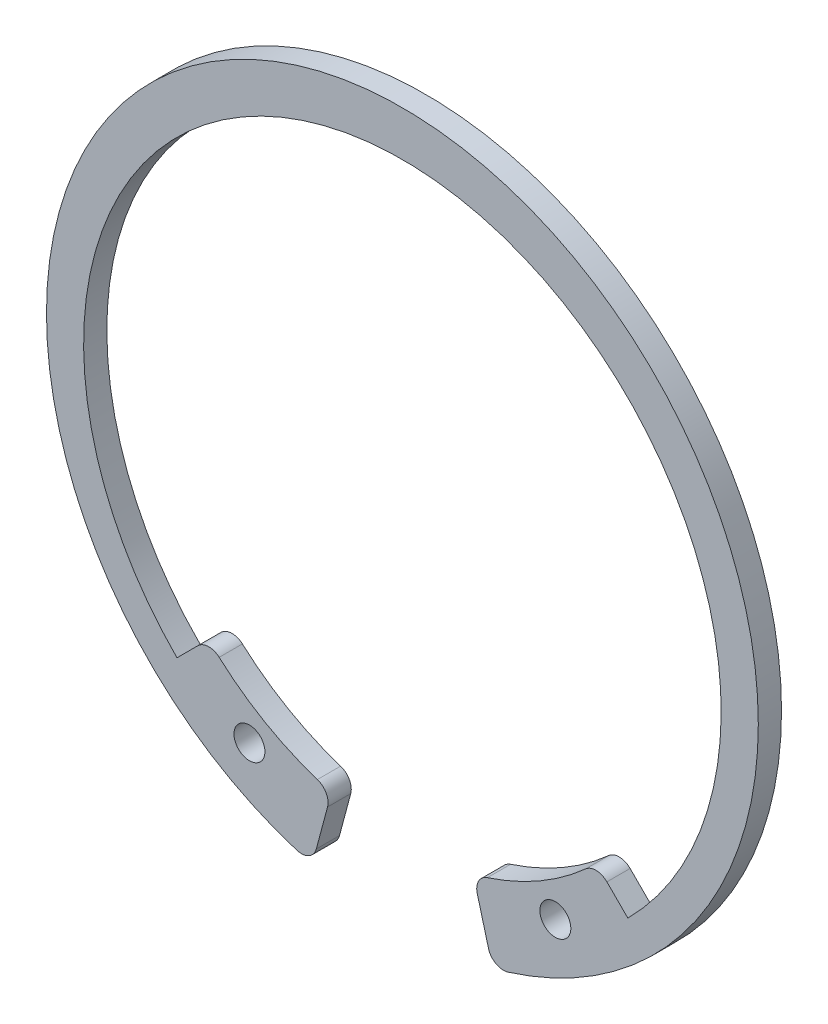
ISO-10303-21;
HEADER;
FILE_DESCRIPTION(('STEP AP214'),'2;1');
FILE_NAME('part.step','',(''),(''),'','','');
FILE_SCHEMA(('AUTOMOTIVE_DESIGN { 1 0 10303 214 1 1 1 1 }'));
ENDSEC;
DATA;
#1=APPLICATION_CONTEXT('core data for automotive mechanical design processes');
#2=APPLICATION_PROTOCOL_DEFINITION('international standard','automotive_design',2000,#1);
#3=PRODUCT_CONTEXT('',#1,'mechanical');
#4=PRODUCT('Part','Part','',(#3));
#5=PRODUCT_RELATED_PRODUCT_CATEGORY('part','',(#4));
#6=PRODUCT_DEFINITION_FORMATION('','',#4);
#7=PRODUCT_DEFINITION_CONTEXT('part definition',#1,'design');
#8=PRODUCT_DEFINITION('design','',#6,#7);
#9=PRODUCT_DEFINITION_SHAPE('','',#8);
#10=(LENGTH_UNIT() NAMED_UNIT(*) SI_UNIT(.MILLI.,.METRE.));
#11=(NAMED_UNIT(*) PLANE_ANGLE_UNIT() SI_UNIT($,.RADIAN.));
#12=(NAMED_UNIT(*) SI_UNIT($,.STERADIAN.) SOLID_ANGLE_UNIT());
#13=UNCERTAINTY_MEASURE_WITH_UNIT(LENGTH_MEASURE(1.E-05),#10,'distance_accuracy_value','');
#14=(GEOMETRIC_REPRESENTATION_CONTEXT(3) GLOBAL_UNCERTAINTY_ASSIGNED_CONTEXT((#13)) GLOBAL_UNIT_ASSIGNED_CONTEXT((#10,
#11,#12)) REPRESENTATION_CONTEXT('',''));
#15=CARTESIAN_POINT('',(0.,0.,0.));
#16=DIRECTION('',(0.,0.,1.));
#17=DIRECTION('',(1.,0.,0.));
#18=AXIS2_PLACEMENT_3D('',#15,#16,#17);
#19=CARTESIAN_POINT('',(12.5086763782379,-13.9228899406109,1.5));
#20=DIRECTION('',(0.,0.,-1.));
#21=DIRECTION('',(-1.,0.,0.));
#22=AXIS2_PLACEMENT_3D('',#19,#20,#21);
#23=PLANE('',#22);
#24=CARTESIAN_POINT('',(-9.88366766904407,-16.9882778844434,1.5));
#25=DIRECTION('',(0.,0.,1.));
#26=DIRECTION('',(1.,0.,0.));
#27=AXIS2_PLACEMENT_3D('',#24,#25,#26);
#28=CIRCLE('',#27,1.);
#29=CARTESIAN_POINT('',(-8.88366766904407,-16.9882778844434,1.5));
#30=VERTEX_POINT('',#29);
#31=EDGE_CURVE('E151',#30,#30,#28,.T.);
#32=ORIENTED_EDGE('',*,*,#31,.F.);
#33=EDGE_LOOP('',(#32));
#34=FACE_BOUND('',#33,.T.);
#35=CARTESIAN_POINT('',(12.5086763782379,-13.9228899406109,1.5));
#36=DIRECTION('',(0.,0.,1.));
#37=DIRECTION('',(-1.,0.,0.));
#38=AXIS2_PLACEMENT_3D('',#35,#36,#37);
#39=CIRCLE('',#38,1.00000000000001);
#40=CARTESIAN_POINT('',(13.2157831594244,-13.2157831594244,1.5));
#41=VERTEX_POINT('',#40);
#42=CARTESIAN_POINT('',(11.8403590783014,-13.1790136158057,1.5));
#43=VERTEX_POINT('',#42);
#44=EDGE_CURVE('E181',#41,#43,#39,.T.);
#45=ORIENTED_EDGE('',*,*,#44,.T.);
#46=CARTESIAN_POINT('',(0.,0.,1.5));
#47=DIRECTION('',(0.,0.,-1.));
#48=DIRECTION('',(1.,0.,0.));
#49=AXIS2_PLACEMENT_3D('',#46,#47,#48);
#50=CIRCLE('',#49,17.7166730225713);
#51=CARTESIAN_POINT('',(5.49318104895808,-16.8435585596416,1.5));
#52=VERTEX_POINT('',#51);
#53=EDGE_CURVE('E146',#43,#52,#50,.T.);
#54=ORIENTED_EDGE('',*,*,#53,.T.);
#55=CARTESIAN_POINT('',(5.80323819354499,-17.7942764815778,1.5));
#56=DIRECTION('',(0.,0.,1.));
#57=DIRECTION('',(-1.,0.,0.));
#58=AXIS2_PLACEMENT_3D('',#55,#56,#57);
#59=CIRCLE('',#58,1.);
#60=CARTESIAN_POINT('',(4.83731236725591,-18.0530955266803,1.5));
#61=VERTEX_POINT('',#60);
#62=EDGE_CURVE('E184',#52,#61,#59,.T.);
#63=ORIENTED_EDGE('',*,*,#62,.T.);
#64=DIRECTION('',(0.258819045102523,-0.965925826289069,0.));
#65=VECTOR('',#64,1.);
#66=CARTESIAN_POINT('',(5.5645589240346,-20.7672166262078,1.5));
#67=LINE('',#66,#65);
#68=CARTESIAN_POINT('',(5.5645589240346,-20.7672166262078,1.5));
#69=VERTEX_POINT('',#68);
#70=EDGE_CURVE('E186',#61,#69,#67,.T.);
#71=ORIENTED_EDGE('',*,*,#70,.T.);
#72=CARTESIAN_POINT('',(6.53048475032366,-20.5083975811053,1.5));
#73=DIRECTION('',(0.,0.,1.));
#74=DIRECTION('',(-1.,0.,0.));
#75=AXIS2_PLACEMENT_3D('',#72,#73,#74);
#76=CIRCLE('',#75,1.);
#77=CARTESIAN_POINT('',(6.82732496624746,-21.4633247438828,1.5));
#78=VERTEX_POINT('',#77);
#79=EDGE_CURVE('E188',#69,#78,#76,.T.);
#80=ORIENTED_EDGE('',*,*,#79,.T.);
#81=CARTESIAN_POINT('',(0.,0.500000000000001,1.5));
#82=DIRECTION('',(0.,0.,1.));
#83=DIRECTION('',(1.,0.,0.));
#84=AXIS2_PLACEMENT_3D('',#81,#82,#83);
#85=CIRCLE('',#84,23.);
#86=CARTESIAN_POINT('',(-6.82732496624744,-21.4633247438828,1.5));
#87=VERTEX_POINT('',#86);
#88=EDGE_CURVE('E190',#78,#87,#85,.T.);
#89=ORIENTED_EDGE('',*,*,#88,.T.);
#90=CARTESIAN_POINT('',(-6.53048475032365,-20.5083975811053,1.5));
#91=DIRECTION('',(0.,0.,1.));
#92=DIRECTION('',(1.,0.,0.));
#93=AXIS2_PLACEMENT_3D('',#90,#91,#92);
#94=CIRCLE('',#93,1.);
#95=CARTESIAN_POINT('',(-5.56455892403457,-20.7672166262078,1.5));
#96=VERTEX_POINT('',#95);
#97=EDGE_CURVE('E192',#87,#96,#94,.T.);
#98=ORIENTED_EDGE('',*,*,#97,.T.);
#99=DIRECTION('',(0.258819045102521,0.965925826289068,0.));
#100=VECTOR('',#99,1.);
#101=CARTESIAN_POINT('',(-5.56455892403457,-20.7672166262078,1.5));
#102=LINE('',#101,#100);
#103=CARTESIAN_POINT('',(-4.83731236725589,-18.0530955266803,1.5));
#104=VERTEX_POINT('',#103);
#105=EDGE_CURVE('E194',#96,#104,#102,.T.);
#106=ORIENTED_EDGE('',*,*,#105,.T.);
#107=CARTESIAN_POINT('',(-5.80323819354496,-17.7942764815777,1.5));
#108=DIRECTION('',(0.,0.,1.));
#109=DIRECTION('',(1.,0.,0.));
#110=AXIS2_PLACEMENT_3D('',#107,#108,#109);
#111=CIRCLE('',#110,1.);
#112=CARTESIAN_POINT('',(-5.49318104895807,-16.8435585596416,1.5));
#113=VERTEX_POINT('',#112);
#114=EDGE_CURVE('E196',#104,#113,#111,.T.);
#115=ORIENTED_EDGE('',*,*,#114,.T.);
#116=CARTESIAN_POINT('',(0.,0.,1.5));
#117=DIRECTION('',(0.,0.,-1.));
#118=DIRECTION('',(1.,0.,0.));
#119=AXIS2_PLACEMENT_3D('',#116,#117,#118);
#120=CIRCLE('',#119,17.7166730225713);
#121=CARTESIAN_POINT('',(-11.8403590783014,-13.1790136158057,1.5));
#122=VERTEX_POINT('',#121);
#123=EDGE_CURVE('E198',#113,#122,#120,.T.);
#124=ORIENTED_EDGE('',*,*,#123,.T.);
#125=CARTESIAN_POINT('',(-12.5086763782379,-13.9228899406109,1.5));
#126=DIRECTION('',(0.,0.,1.));
#127=DIRECTION('',(-1.,0.,0.));
#128=AXIS2_PLACEMENT_3D('',#125,#126,#127);
#129=CIRCLE('',#128,1.);
#130=CARTESIAN_POINT('',(-13.2157831594244,-13.2157831594243,1.5));
#131=VERTEX_POINT('',#130);
#132=EDGE_CURVE('E200',#122,#131,#129,.T.);
#133=ORIENTED_EDGE('',*,*,#132,.T.);
#134=DIRECTION('',(-0.707106781186549,-0.707106781186546,0.));
#135=VECTOR('',#134,1.);
#136=CARTESIAN_POINT('',(-13.2157831594244,-13.2157831594243,1.5));
#137=LINE('',#136,#135);
#138=CARTESIAN_POINT('',(-14.5663996924429,-14.5663996924429,1.5));
#139=VERTEX_POINT('',#138);
#140=EDGE_CURVE('E202',#131,#139,#137,.T.);
#141=ORIENTED_EDGE('',*,*,#140,.T.);
#142=CARTESIAN_POINT('',(0.,0.,1.5));
#143=DIRECTION('',(0.,0.,-1.));
#144=DIRECTION('',(1.,0.,0.));
#145=AXIS2_PLACEMENT_3D('',#142,#143,#144);
#146=CIRCLE('',#145,20.6);
#147=CARTESIAN_POINT('',(14.5663996924429,-14.5663996924429,1.5));
#148=VERTEX_POINT('',#147);
#149=EDGE_CURVE('E51',#139,#148,#146,.T.);
#150=ORIENTED_EDGE('',*,*,#149,.T.);
#151=DIRECTION('',(-0.70710678118655,0.707106781186547,0.));
#152=VECTOR('',#151,1.);
#153=CARTESIAN_POINT('',(13.2157831594244,-13.2157831594244,1.5));
#154=LINE('',#153,#152);
#155=EDGE_CURVE('E46',#148,#41,#154,.T.);
#156=ORIENTED_EDGE('',*,*,#155,.T.);
#157=EDGE_LOOP('',(#45,#54,#63,#71,#80,#89,#98,#106,#115,#124,#133,#141,#150,#156));
#158=FACE_BOUND('',#157,.T.);
#159=CARTESIAN_POINT('',(9.88366766904409,-16.9882778844435,1.5));
#160=DIRECTION('',(0.,0.,1.));
#161=DIRECTION('',(-1.,0.,0.));
#162=AXIS2_PLACEMENT_3D('',#159,#160,#161);
#163=CIRCLE('',#162,1.);
#164=CARTESIAN_POINT('',(8.88366766904408,-16.9882778844435,1.5));
#165=VERTEX_POINT('',#164);
#166=EDGE_CURVE('E321',#165,#165,#163,.T.);
#167=ORIENTED_EDGE('',*,*,#166,.F.);
#168=EDGE_LOOP('',(#167));
#169=FACE_BOUND('',#168,.T.);
#170=ADVANCED_FACE('F31',(#34,#158,#169),#23,.F.);
#171=CARTESIAN_POINT('',(12.5086763782379,-13.9228899406109,0.));
#172=DIRECTION('',(0.,0.,-1.));
#173=DIRECTION('',(-1.,0.,0.));
#174=AXIS2_PLACEMENT_3D('',#171,#172,#173);
#175=PLANE('',#174);
#176=CARTESIAN_POINT('',(-9.88366766904407,-16.9882778844434,0.));
#177=DIRECTION('',(0.,0.,1.));
#178=DIRECTION('',(1.,0.,0.));
#179=AXIS2_PLACEMENT_3D('',#176,#177,#178);
#180=CIRCLE('',#179,1.);
#181=CARTESIAN_POINT('',(-8.88366766904407,-16.9882778844434,0.));
#182=VERTEX_POINT('',#181);
#183=EDGE_CURVE('E154',#182,#182,#180,.T.);
#184=ORIENTED_EDGE('',*,*,#183,.T.);
#185=EDGE_LOOP('',(#184));
#186=FACE_BOUND('',#185,.T.);
#187=CARTESIAN_POINT('',(12.5086763782379,-13.9228899406109,0.));
#188=DIRECTION('',(0.,0.,1.));
#189=DIRECTION('',(-1.,0.,0.));
#190=AXIS2_PLACEMENT_3D('',#187,#188,#189);
#191=CIRCLE('',#190,1.00000000000001);
#192=CARTESIAN_POINT('',(13.2157831594244,-13.2157831594244,0.));
#193=VERTEX_POINT('',#192);
#194=CARTESIAN_POINT('',(11.8403590783014,-13.1790136158057,0.));
#195=VERTEX_POINT('',#194);
#196=EDGE_CURVE('E137',#193,#195,#191,.T.);
#197=ORIENTED_EDGE('',*,*,#196,.F.);
#198=DIRECTION('',(-0.70710678118655,0.707106781186547,0.));
#199=VECTOR('',#198,1.);
#200=CARTESIAN_POINT('',(13.2157831594244,-13.2157831594244,0.));
#201=LINE('',#200,#199);
#202=CARTESIAN_POINT('',(14.5663996924429,-14.5663996924429,0.));
#203=VERTEX_POINT('',#202);
#204=EDGE_CURVE('E179',#203,#193,#201,.T.);
#205=ORIENTED_EDGE('',*,*,#204,.F.);
#206=CARTESIAN_POINT('',(0.,0.,0.));
#207=DIRECTION('',(0.,0.,-1.));
#208=DIRECTION('',(1.,0.,0.));
#209=AXIS2_PLACEMENT_3D('',#206,#207,#208);
#210=CIRCLE('',#209,20.6);
#211=CARTESIAN_POINT('',(-14.5663996924429,-14.5663996924429,0.));
#212=VERTEX_POINT('',#211);
#213=EDGE_CURVE('E177',#212,#203,#210,.T.);
#214=ORIENTED_EDGE('',*,*,#213,.F.);
#215=DIRECTION('',(-0.707106781186549,-0.707106781186546,0.));
#216=VECTOR('',#215,1.);
#217=CARTESIAN_POINT('',(-13.2157831594244,-13.2157831594243,0.));
#218=LINE('',#217,#216);
#219=CARTESIAN_POINT('',(-13.2157831594244,-13.2157831594243,0.));
#220=VERTEX_POINT('',#219);
#221=EDGE_CURVE('E175',#220,#212,#218,.T.);
#222=ORIENTED_EDGE('',*,*,#221,.F.);
#223=CARTESIAN_POINT('',(-12.5086763782379,-13.9228899406109,0.));
#224=DIRECTION('',(0.,0.,1.));
#225=DIRECTION('',(-1.,0.,0.));
#226=AXIS2_PLACEMENT_3D('',#223,#224,#225);
#227=CIRCLE('',#226,1.);
#228=CARTESIAN_POINT('',(-11.8403590783014,-13.1790136158057,0.));
#229=VERTEX_POINT('',#228);
#230=EDGE_CURVE('E173',#229,#220,#227,.T.);
#231=ORIENTED_EDGE('',*,*,#230,.F.);
#232=CARTESIAN_POINT('',(0.,0.,0.));
#233=DIRECTION('',(0.,0.,-1.));
#234=DIRECTION('',(1.,0.,0.));
#235=AXIS2_PLACEMENT_3D('',#232,#233,#234);
#236=CIRCLE('',#235,17.7166730225713);
#237=CARTESIAN_POINT('',(-5.49318104895807,-16.8435585596416,0.));
#238=VERTEX_POINT('',#237);
#239=EDGE_CURVE('E171',#238,#229,#236,.T.);
#240=ORIENTED_EDGE('',*,*,#239,.F.);
#241=CARTESIAN_POINT('',(-5.80323819354496,-17.7942764815777,0.));
#242=DIRECTION('',(0.,0.,1.));
#243=DIRECTION('',(1.,0.,0.));
#244=AXIS2_PLACEMENT_3D('',#241,#242,#243);
#245=CIRCLE('',#244,1.);
#246=CARTESIAN_POINT('',(-4.83731236725589,-18.0530955266803,0.));
#247=VERTEX_POINT('',#246);
#248=EDGE_CURVE('E169',#247,#238,#245,.T.);
#249=ORIENTED_EDGE('',*,*,#248,.F.);
#250=DIRECTION('',(0.258819045102521,0.965925826289068,0.));
#251=VECTOR('',#250,1.);
#252=CARTESIAN_POINT('',(-5.56455892403457,-20.7672166262078,0.));
#253=LINE('',#252,#251);
#254=CARTESIAN_POINT('',(-5.56455892403457,-20.7672166262078,0.));
#255=VERTEX_POINT('',#254);
#256=EDGE_CURVE('E167',#255,#247,#253,.T.);
#257=ORIENTED_EDGE('',*,*,#256,.F.);
#258=CARTESIAN_POINT('',(-6.53048475032365,-20.5083975811053,0.));
#259=DIRECTION('',(0.,0.,1.));
#260=DIRECTION('',(1.,0.,0.));
#261=AXIS2_PLACEMENT_3D('',#258,#259,#260);
#262=CIRCLE('',#261,1.);
#263=CARTESIAN_POINT('',(-6.82732496624744,-21.4633247438828,0.));
#264=VERTEX_POINT('',#263);
#265=EDGE_CURVE('E165',#264,#255,#262,.T.);
#266=ORIENTED_EDGE('',*,*,#265,.F.);
#267=CARTESIAN_POINT('',(0.,0.500000000000001,0.));
#268=DIRECTION('',(0.,0.,1.));
#269=DIRECTION('',(1.,0.,0.));
#270=AXIS2_PLACEMENT_3D('',#267,#268,#269);
#271=CIRCLE('',#270,23.);
#272=CARTESIAN_POINT('',(6.82732496624746,-21.4633247438828,0.));
#273=VERTEX_POINT('',#272);
#274=EDGE_CURVE('E163',#273,#264,#271,.T.);
#275=ORIENTED_EDGE('',*,*,#274,.F.);
#276=CARTESIAN_POINT('',(6.53048475032366,-20.5083975811053,0.));
#277=DIRECTION('',(0.,0.,1.));
#278=DIRECTION('',(-1.,0.,0.));
#279=AXIS2_PLACEMENT_3D('',#276,#277,#278);
#280=CIRCLE('',#279,1.);
#281=CARTESIAN_POINT('',(5.5645589240346,-20.7672166262078,0.));
#282=VERTEX_POINT('',#281);
#283=EDGE_CURVE('E161',#282,#273,#280,.T.);
#284=ORIENTED_EDGE('',*,*,#283,.F.);
#285=DIRECTION('',(0.258819045102523,-0.965925826289069,0.));
#286=VECTOR('',#285,1.);
#287=CARTESIAN_POINT('',(5.5645589240346,-20.7672166262078,0.));
#288=LINE('',#287,#286);
#289=CARTESIAN_POINT('',(4.83731236725591,-18.0530955266803,0.));
#290=VERTEX_POINT('',#289);
#291=EDGE_CURVE('E159',#290,#282,#288,.T.);
#292=ORIENTED_EDGE('',*,*,#291,.F.);
#293=CARTESIAN_POINT('',(5.80323819354499,-17.7942764815778,0.));
#294=DIRECTION('',(0.,0.,1.));
#295=DIRECTION('',(-1.,0.,0.));
#296=AXIS2_PLACEMENT_3D('',#293,#294,#295);
#297=CIRCLE('',#296,1.);
#298=CARTESIAN_POINT('',(5.49318104895808,-16.8435585596416,0.));
#299=VERTEX_POINT('',#298);
#300=EDGE_CURVE('E139',#299,#290,#297,.T.);
#301=ORIENTED_EDGE('',*,*,#300,.F.);
#302=CARTESIAN_POINT('',(0.,0.,0.));
#303=DIRECTION('',(0.,0.,-1.));
#304=DIRECTION('',(1.,0.,0.));
#305=AXIS2_PLACEMENT_3D('',#302,#303,#304);
#306=CIRCLE('',#305,17.7166730225713);
#307=EDGE_CURVE('E132',#195,#299,#306,.T.);
#308=ORIENTED_EDGE('',*,*,#307,.F.);
#309=EDGE_LOOP('',(#197,#205,#214,#222,#231,#240,#249,#257,#266,#275,#284,#292,#301,#308));
#310=FACE_BOUND('',#309,.T.);
#311=CARTESIAN_POINT('',(9.88366766904409,-16.9882778844435,0.));
#312=DIRECTION('',(0.,0.,1.));
#313=DIRECTION('',(-1.,0.,0.));
#314=AXIS2_PLACEMENT_3D('',#311,#312,#313);
#315=CIRCLE('',#314,1.);
#316=CARTESIAN_POINT('',(8.88366766904408,-16.9882778844435,0.));
#317=VERTEX_POINT('',#316);
#318=EDGE_CURVE('E324',#317,#317,#315,.T.);
#319=ORIENTED_EDGE('',*,*,#318,.T.);
#320=EDGE_LOOP('',(#319));
#321=FACE_BOUND('',#320,.T.);
#322=ADVANCED_FACE('F133',(#186,#310,#321),#175,.T.);
#323=CARTESIAN_POINT('',(12.5086763782379,-13.9228899406109,1.5));
#324=DIRECTION('',(0.,0.,-1.));
#325=DIRECTION('',(-1.,0.,0.));
#326=AXIS2_PLACEMENT_3D('',#323,#324,#325);
#327=CYLINDRICAL_SURFACE('',#326,1.00000000000001);
#328=ORIENTED_EDGE('',*,*,#196,.T.);
#329=DIRECTION('',(0.,0.,-1.));
#330=VECTOR('',#329,1.);
#331=CARTESIAN_POINT('',(11.8403590783014,-13.1790136158057,1.5));
#332=LINE('',#331,#330);
#333=EDGE_CURVE('E11',#43,#195,#332,.T.);
#334=ORIENTED_EDGE('',*,*,#333,.F.);
#335=ORIENTED_EDGE('',*,*,#44,.F.);
#336=DIRECTION('',(0.,0.,-1.));
#337=VECTOR('',#336,1.);
#338=CARTESIAN_POINT('',(13.2157831594244,-13.2157831594244,1.5));
#339=LINE('',#338,#337);
#340=EDGE_CURVE('E150',#41,#193,#339,.T.);
#341=ORIENTED_EDGE('',*,*,#340,.T.);
#342=EDGE_LOOP('',(#328,#334,#335,#341));
#343=FACE_BOUND('',#342,.T.);
#344=ADVANCED_FACE('F33',(#343),#327,.T.);
#345=CARTESIAN_POINT('',(0.,0.,1.5));
#346=DIRECTION('',(0.,0.,-1.));
#347=DIRECTION('',(-1.,0.,0.));
#348=AXIS2_PLACEMENT_3D('',#345,#346,#347);
#349=CYLINDRICAL_SURFACE('',#348,17.7166730225713);
#350=ORIENTED_EDGE('',*,*,#307,.T.);
#351=DIRECTION('',(0.,0.,-1.));
#352=VECTOR('',#351,1.);
#353=CARTESIAN_POINT('',(5.49318104895808,-16.8435585596416,1.5));
#354=LINE('',#353,#352);
#355=EDGE_CURVE('E39',#52,#299,#354,.T.);
#356=ORIENTED_EDGE('',*,*,#355,.F.);
#357=ORIENTED_EDGE('',*,*,#53,.F.);
#358=ORIENTED_EDGE('',*,*,#333,.T.);
#359=EDGE_LOOP('',(#350,#356,#357,#358));
#360=FACE_BOUND('',#359,.T.);
#361=ADVANCED_FACE('F145',(#360),#349,.F.);
#362=CARTESIAN_POINT('',(5.80323819354499,-17.7942764815778,1.5));
#363=DIRECTION('',(0.,0.,-1.));
#364=DIRECTION('',(-1.,0.,0.));
#365=AXIS2_PLACEMENT_3D('',#362,#363,#364);
#366=CYLINDRICAL_SURFACE('',#365,1.);
#367=ORIENTED_EDGE('',*,*,#300,.T.);
#368=DIRECTION('',(0.,0.,-1.));
#369=VECTOR('',#368,1.);
#370=CARTESIAN_POINT('',(4.83731236725591,-18.0530955266803,1.5));
#371=LINE('',#370,#369);
#372=EDGE_CURVE('E237',#61,#290,#371,.T.);
#373=ORIENTED_EDGE('',*,*,#372,.F.);
#374=ORIENTED_EDGE('',*,*,#62,.F.);
#375=ORIENTED_EDGE('',*,*,#355,.T.);
#376=EDGE_LOOP('',(#367,#373,#374,#375));
#377=FACE_BOUND('',#376,.T.);
#378=ADVANCED_FACE('F241',(#377),#366,.T.);
#379=CARTESIAN_POINT('',(5.5645589240346,-20.7672166262078,1.5));
#380=DIRECTION('',(0.965925826289069,0.258819045102522,0.));
#381=DIRECTION('',(-0.258819045102523,0.965925826289069,0.));
#382=AXIS2_PLACEMENT_3D('',#379,#380,#381);
#383=PLANE('',#382);
#384=ORIENTED_EDGE('',*,*,#291,.T.);
#385=DIRECTION('',(0.,0.,-1.));
#386=VECTOR('',#385,1.);
#387=CARTESIAN_POINT('',(5.5645589240346,-20.7672166262078,1.5));
#388=LINE('',#387,#386);
#389=EDGE_CURVE('E234',#69,#282,#388,.T.);
#390=ORIENTED_EDGE('',*,*,#389,.F.);
#391=ORIENTED_EDGE('',*,*,#70,.F.);
#392=ORIENTED_EDGE('',*,*,#372,.T.);
#393=EDGE_LOOP('',(#384,#390,#391,#392));
#394=FACE_BOUND('',#393,.T.);
#395=ADVANCED_FACE('F249',(#394),#383,.F.);
#396=CARTESIAN_POINT('',(6.53048475032366,-20.5083975811053,1.5));
#397=DIRECTION('',(0.,0.,-1.));
#398=DIRECTION('',(-1.,0.,0.));
#399=AXIS2_PLACEMENT_3D('',#396,#397,#398);
#400=CYLINDRICAL_SURFACE('',#399,1.);
#401=ORIENTED_EDGE('',*,*,#283,.T.);
#402=DIRECTION('',(0.,0.,-1.));
#403=VECTOR('',#402,1.);
#404=CARTESIAN_POINT('',(6.82732496624746,-21.4633247438828,1.5));
#405=LINE('',#404,#403);
#406=EDGE_CURVE('E231',#78,#273,#405,.T.);
#407=ORIENTED_EDGE('',*,*,#406,.F.);
#408=ORIENTED_EDGE('',*,*,#79,.F.);
#409=ORIENTED_EDGE('',*,*,#389,.T.);
#410=EDGE_LOOP('',(#401,#407,#408,#409));
#411=FACE_BOUND('',#410,.T.);
#412=ADVANCED_FACE('F252',(#411),#400,.T.);
#413=CARTESIAN_POINT('',(0.,0.500000000000001,1.5));
#414=DIRECTION('',(0.,0.,-1.));
#415=DIRECTION('',(-1.,0.,0.));
#416=AXIS2_PLACEMENT_3D('',#413,#414,#415);
#417=CYLINDRICAL_SURFACE('',#416,23.);
#418=ORIENTED_EDGE('',*,*,#274,.T.);
#419=DIRECTION('',(0.,0.,-1.));
#420=VECTOR('',#419,1.);
#421=CARTESIAN_POINT('',(-6.82732496624744,-21.4633247438828,1.5));
#422=LINE('',#421,#420);
#423=EDGE_CURVE('E228',#87,#264,#422,.T.);
#424=ORIENTED_EDGE('',*,*,#423,.F.);
#425=ORIENTED_EDGE('',*,*,#88,.F.);
#426=ORIENTED_EDGE('',*,*,#406,.T.);
#427=EDGE_LOOP('',(#418,#424,#425,#426));
#428=FACE_BOUND('',#427,.T.);
#429=ADVANCED_FACE('F257',(#428),#417,.T.);
#430=CARTESIAN_POINT('',(-6.53048475032365,-20.5083975811053,1.5));
#431=DIRECTION('',(0.,0.,-1.));
#432=DIRECTION('',(-1.,0.,0.));
#433=AXIS2_PLACEMENT_3D('',#430,#431,#432);
#434=CYLINDRICAL_SURFACE('',#433,1.);
#435=ORIENTED_EDGE('',*,*,#265,.T.);
#436=DIRECTION('',(0.,0.,-1.));
#437=VECTOR('',#436,1.);
#438=CARTESIAN_POINT('',(-5.56455892403457,-20.7672166262078,1.5));
#439=LINE('',#438,#437);
#440=EDGE_CURVE('E225',#96,#255,#439,.T.);
#441=ORIENTED_EDGE('',*,*,#440,.F.);
#442=ORIENTED_EDGE('',*,*,#97,.F.);
#443=ORIENTED_EDGE('',*,*,#423,.T.);
#444=EDGE_LOOP('',(#435,#441,#442,#443));
#445=FACE_BOUND('',#444,.T.);
#446=ADVANCED_FACE('F263',(#445),#434,.T.);
#447=CARTESIAN_POINT('',(-5.56455892403457,-20.7672166262078,1.5));
#448=DIRECTION('',(-0.965925826289068,0.258819045102522,0.));
#449=DIRECTION('',(-0.258819045102521,-0.965925826289068,0.));
#450=AXIS2_PLACEMENT_3D('',#447,#448,#449);
#451=PLANE('',#450);
#452=ORIENTED_EDGE('',*,*,#256,.T.);
#453=DIRECTION('',(0.,0.,-1.));
#454=VECTOR('',#453,1.);
#455=CARTESIAN_POINT('',(-4.83731236725589,-18.0530955266803,1.5));
#456=LINE('',#455,#454);
#457=EDGE_CURVE('E222',#104,#247,#456,.T.);
#458=ORIENTED_EDGE('',*,*,#457,.F.);
#459=ORIENTED_EDGE('',*,*,#105,.F.);
#460=ORIENTED_EDGE('',*,*,#440,.T.);
#461=EDGE_LOOP('',(#452,#458,#459,#460));
#462=FACE_BOUND('',#461,.T.);
#463=ADVANCED_FACE('F267',(#462),#451,.F.);
#464=CARTESIAN_POINT('',(-5.80323819354496,-17.7942764815777,1.5));
#465=DIRECTION('',(0.,0.,-1.));
#466=DIRECTION('',(-1.,0.,0.));
#467=AXIS2_PLACEMENT_3D('',#464,#465,#466);
#468=CYLINDRICAL_SURFACE('',#467,1.);
#469=ORIENTED_EDGE('',*,*,#248,.T.);
#470=DIRECTION('',(0.,0.,-1.));
#471=VECTOR('',#470,1.);
#472=CARTESIAN_POINT('',(-5.49318104895807,-16.8435585596416,1.5));
#473=LINE('',#472,#471);
#474=EDGE_CURVE('E219',#113,#238,#473,.T.);
#475=ORIENTED_EDGE('',*,*,#474,.F.);
#476=ORIENTED_EDGE('',*,*,#114,.F.);
#477=ORIENTED_EDGE('',*,*,#457,.T.);
#478=EDGE_LOOP('',(#469,#475,#476,#477));
#479=FACE_BOUND('',#478,.T.);
#480=ADVANCED_FACE('F272',(#479),#468,.T.);
#481=CARTESIAN_POINT('',(0.,0.,1.5));
#482=DIRECTION('',(0.,0.,-1.));
#483=DIRECTION('',(-1.,0.,0.));
#484=AXIS2_PLACEMENT_3D('',#481,#482,#483);
#485=CYLINDRICAL_SURFACE('',#484,17.7166730225713);
#486=ORIENTED_EDGE('',*,*,#239,.T.);
#487=DIRECTION('',(0.,0.,-1.));
#488=VECTOR('',#487,1.);
#489=CARTESIAN_POINT('',(-11.8403590783014,-13.1790136158057,1.5));
#490=LINE('',#489,#488);
#491=EDGE_CURVE('E216',#122,#229,#490,.T.);
#492=ORIENTED_EDGE('',*,*,#491,.F.);
#493=ORIENTED_EDGE('',*,*,#123,.F.);
#494=ORIENTED_EDGE('',*,*,#474,.T.);
#495=EDGE_LOOP('',(#486,#492,#493,#494));
#496=FACE_BOUND('',#495,.T.);
#497=ADVANCED_FACE('F278',(#496),#485,.F.);
#498=CARTESIAN_POINT('',(-12.5086763782379,-13.9228899406109,1.5));
#499=DIRECTION('',(0.,0.,-1.));
#500=DIRECTION('',(-1.,0.,0.));
#501=AXIS2_PLACEMENT_3D('',#498,#499,#500);
#502=CYLINDRICAL_SURFACE('',#501,1.);
#503=ORIENTED_EDGE('',*,*,#230,.T.);
#504=DIRECTION('',(0.,0.,-1.));
#505=VECTOR('',#504,1.);
#506=CARTESIAN_POINT('',(-13.2157831594244,-13.2157831594243,1.5));
#507=LINE('',#506,#505);
#508=EDGE_CURVE('E213',#131,#220,#507,.T.);
#509=ORIENTED_EDGE('',*,*,#508,.F.);
#510=ORIENTED_EDGE('',*,*,#132,.F.);
#511=ORIENTED_EDGE('',*,*,#491,.T.);
#512=EDGE_LOOP('',(#503,#509,#510,#511));
#513=FACE_BOUND('',#512,.T.);
#514=ADVANCED_FACE('F282',(#513),#502,.T.);
#515=CARTESIAN_POINT('',(-13.2157831594244,-13.2157831594243,1.5));
#516=DIRECTION('',(0.707106781186547,-0.70710678118655,0.));
#517=DIRECTION('',(0.707106781186549,0.707106781186546,0.));
#518=AXIS2_PLACEMENT_3D('',#515,#516,#517);
#519=PLANE('',#518);
#520=ORIENTED_EDGE('',*,*,#221,.T.);
#521=DIRECTION('',(0.,0.,-1.));
#522=VECTOR('',#521,1.);
#523=CARTESIAN_POINT('',(-14.5663996924429,-14.5663996924429,1.5));
#524=LINE('',#523,#522);
#525=EDGE_CURVE('E210',#139,#212,#524,.T.);
#526=ORIENTED_EDGE('',*,*,#525,.F.);
#527=ORIENTED_EDGE('',*,*,#140,.F.);
#528=ORIENTED_EDGE('',*,*,#508,.T.);
#529=EDGE_LOOP('',(#520,#526,#527,#528));
#530=FACE_BOUND('',#529,.T.);
#531=ADVANCED_FACE('F287',(#530),#519,.F.);
#532=CARTESIAN_POINT('',(0.,0.,1.5));
#533=DIRECTION('',(0.,0.,-1.));
#534=DIRECTION('',(-1.,0.,0.));
#535=AXIS2_PLACEMENT_3D('',#532,#533,#534);
#536=CYLINDRICAL_SURFACE('',#535,20.6);
#537=ORIENTED_EDGE('',*,*,#213,.T.);
#538=DIRECTION('',(0.,0.,-1.));
#539=VECTOR('',#538,1.);
#540=CARTESIAN_POINT('',(14.5663996924429,-14.5663996924429,1.5));
#541=LINE('',#540,#539);
#542=EDGE_CURVE('E207',#148,#203,#541,.T.);
#543=ORIENTED_EDGE('',*,*,#542,.F.);
#544=ORIENTED_EDGE('',*,*,#149,.F.);
#545=ORIENTED_EDGE('',*,*,#525,.T.);
#546=EDGE_LOOP('',(#537,#543,#544,#545));
#547=FACE_BOUND('',#546,.T.);
#548=ADVANCED_FACE('F290',(#547),#536,.F.);
#549=CARTESIAN_POINT('',(13.2157831594244,-13.2157831594244,1.5));
#550=DIRECTION('',(-0.707106781186546,-0.707106781186549,0.));
#551=DIRECTION('',(0.70710678118655,-0.707106781186547,0.));
#552=AXIS2_PLACEMENT_3D('',#549,#550,#551);
#553=PLANE('',#552);
#554=ORIENTED_EDGE('',*,*,#204,.T.);
#555=ORIENTED_EDGE('',*,*,#340,.F.);
#556=ORIENTED_EDGE('',*,*,#155,.F.);
#557=ORIENTED_EDGE('',*,*,#542,.T.);
#558=EDGE_LOOP('',(#554,#555,#556,#557));
#559=FACE_BOUND('',#558,.T.);
#560=ADVANCED_FACE('F292',(#559),#553,.F.);
#561=CARTESIAN_POINT('',(-9.88366766904407,-16.9882778844434,1.5));
#562=DIRECTION('',(0.,0.,-1.));
#563=DIRECTION('',(-1.,0.,0.));
#564=AXIS2_PLACEMENT_3D('',#561,#562,#563);
#565=CYLINDRICAL_SURFACE('',#564,1.);
#566=ORIENTED_EDGE('',*,*,#31,.T.);
#567=EDGE_LOOP('',(#566));
#568=FACE_BOUND('',#567,.T.);
#569=ORIENTED_EDGE('',*,*,#183,.F.);
#570=EDGE_LOOP('',(#569));
#571=FACE_BOUND('',#570,.T.);
#572=ADVANCED_FACE('F294',(#568,#571),#565,.F.);
#573=CARTESIAN_POINT('',(9.88366766904409,-16.9882778844435,1.5));
#574=DIRECTION('',(0.,0.,-1.));
#575=DIRECTION('',(-1.,0.,0.));
#576=AXIS2_PLACEMENT_3D('',#573,#574,#575);
#577=CYLINDRICAL_SURFACE('',#576,1.);
#578=ORIENTED_EDGE('',*,*,#166,.T.);
#579=EDGE_LOOP('',(#578));
#580=FACE_BOUND('',#579,.T.);
#581=ORIENTED_EDGE('',*,*,#318,.F.);
#582=EDGE_LOOP('',(#581));
#583=FACE_BOUND('',#582,.T.);
#584=ADVANCED_FACE('F300',(#580,#583),#577,.F.);
#585=CLOSED_SHELL('',(#170,#322,#344,#361,#378,#395,#412,#429,#446,#463,#480,#497,#514,#531,
#548,#560,#572,#584));
#586=MANIFOLD_SOLID_BREP('B2',#585);
#587=ADVANCED_BREP_SHAPE_REPRESENTATION('',(#18,#586),#14);
#588=SHAPE_DEFINITION_REPRESENTATION(#9,#587);
ENDSEC;
END-ISO-10303-21;
